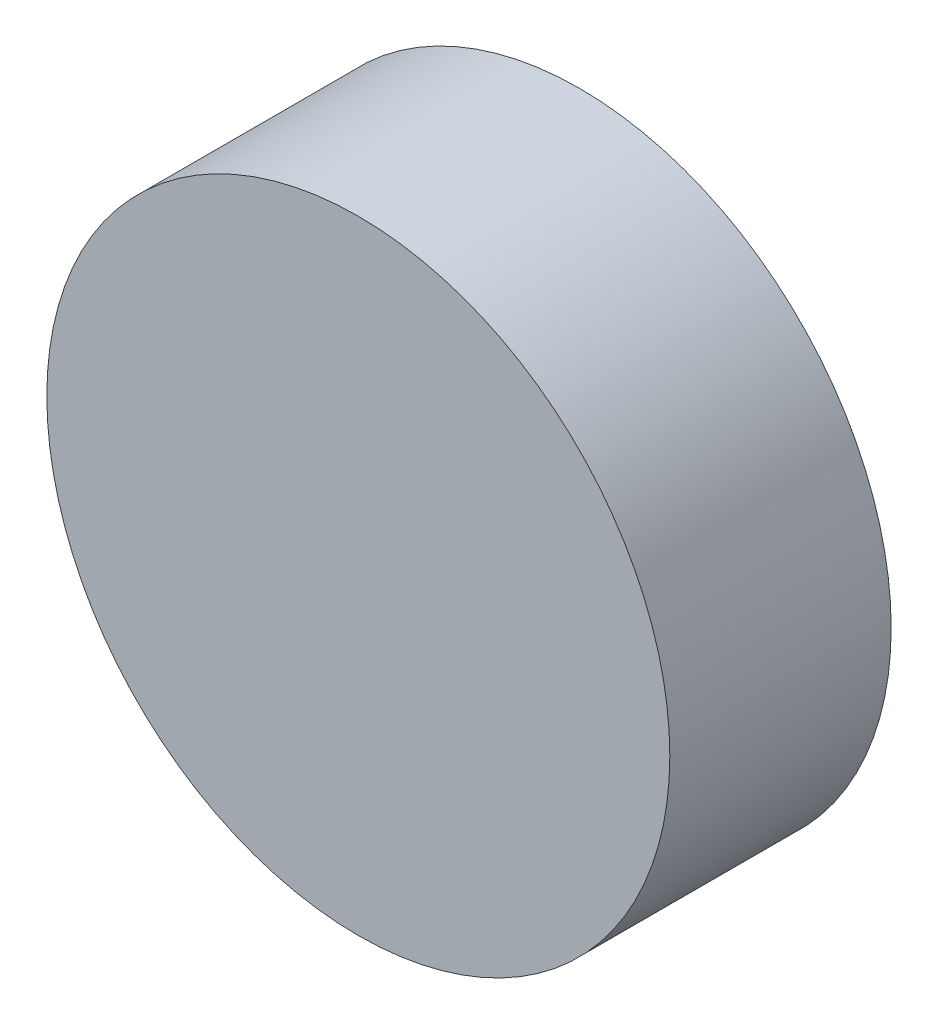
ISO-10303-21;
HEADER;
FILE_DESCRIPTION(('STEP AP214'),'2;1');
FILE_NAME('part.step','',(''),(''),'','','');
FILE_SCHEMA(('AUTOMOTIVE_DESIGN { 1 0 10303 214 1 1 1 1 }'));
ENDSEC;
DATA;
#1=APPLICATION_CONTEXT('core data for automotive mechanical design processes');
#2=APPLICATION_PROTOCOL_DEFINITION('international standard','automotive_design',2000,#1);
#3=PRODUCT_CONTEXT('',#1,'mechanical');
#4=PRODUCT('Part','Part','',(#3));
#5=PRODUCT_RELATED_PRODUCT_CATEGORY('part','',(#4));
#6=PRODUCT_DEFINITION_FORMATION('','',#4);
#7=PRODUCT_DEFINITION_CONTEXT('part definition',#1,'design');
#8=PRODUCT_DEFINITION('design','',#6,#7);
#9=PRODUCT_DEFINITION_SHAPE('','',#8);
#10=(LENGTH_UNIT() NAMED_UNIT(*) SI_UNIT(.MILLI.,.METRE.));
#11=(NAMED_UNIT(*) PLANE_ANGLE_UNIT() SI_UNIT($,.RADIAN.));
#12=(NAMED_UNIT(*) SI_UNIT($,.STERADIAN.) SOLID_ANGLE_UNIT());
#13=UNCERTAINTY_MEASURE_WITH_UNIT(LENGTH_MEASURE(1.E-05),#10,'distance_accuracy_value','');
#14=(GEOMETRIC_REPRESENTATION_CONTEXT(3) GLOBAL_UNCERTAINTY_ASSIGNED_CONTEXT((#13)) GLOBAL_UNIT_ASSIGNED_CONTEXT((#10,
#11,#12)) REPRESENTATION_CONTEXT('',''));
#15=CARTESIAN_POINT('',(0.,0.,0.));
#16=DIRECTION('',(0.,0.,1.));
#17=DIRECTION('',(1.,0.,0.));
#18=AXIS2_PLACEMENT_3D('',#15,#16,#17);
#19=CARTESIAN_POINT('',(0.,0.,50.8));
#20=DIRECTION('',(0.,0.,-1.));
#21=DIRECTION('',(-1.,0.,0.));
#22=AXIS2_PLACEMENT_3D('',#19,#20,#21);
#23=CYLINDRICAL_SURFACE('',#22,71.4883);
#24=CARTESIAN_POINT('',(0.,0.,50.8));
#25=DIRECTION('',(0.,0.,1.));
#26=DIRECTION('',(1.,0.,0.));
#27=AXIS2_PLACEMENT_3D('',#24,#25,#26);
#28=CIRCLE('',#27,71.4883);
#29=CARTESIAN_POINT('',(71.4883,0.,50.8));
#30=VERTEX_POINT('',#29);
#31=EDGE_CURVE('E10',#30,#30,#28,.T.);
#32=ORIENTED_EDGE('',*,*,#31,.F.);
#33=EDGE_LOOP('',(#32));
#34=FACE_BOUND('',#33,.T.);
#35=CARTESIAN_POINT('',(0.,0.,0.));
#36=DIRECTION('',(0.,0.,1.));
#37=DIRECTION('',(1.,0.,0.));
#38=AXIS2_PLACEMENT_3D('',#35,#36,#37);
#39=CIRCLE('',#38,71.4883);
#40=CARTESIAN_POINT('',(71.4883,0.,0.));
#41=VERTEX_POINT('',#40);
#42=EDGE_CURVE('E40',#41,#41,#39,.T.);
#43=ORIENTED_EDGE('',*,*,#42,.T.);
#44=EDGE_LOOP('',(#43));
#45=FACE_BOUND('',#44,.T.);
#46=ADVANCED_FACE('F37',(#34,#45),#23,.T.);
#47=CARTESIAN_POINT('',(0.,0.,50.8));
#48=DIRECTION('',(0.,0.,1.));
#49=DIRECTION('',(1.,0.,0.));
#50=AXIS2_PLACEMENT_3D('',#47,#48,#49);
#51=PLANE('',#50);
#52=ORIENTED_EDGE('',*,*,#31,.T.);
#53=EDGE_LOOP('',(#52));
#54=FACE_BOUND('',#53,.T.);
#55=ADVANCED_FACE('F54',(#54),#51,.T.);
#56=CARTESIAN_POINT('',(0.,0.,0.));
#57=DIRECTION('',(0.,0.,1.));
#58=DIRECTION('',(1.,0.,0.));
#59=AXIS2_PLACEMENT_3D('',#56,#57,#58);
#60=PLANE('',#59);
#61=ORIENTED_EDGE('',*,*,#42,.F.);
#62=EDGE_LOOP('',(#61));
#63=FACE_BOUND('',#62,.T.);
#64=ADVANCED_FACE('F52',(#63),#60,.F.);
#65=CLOSED_SHELL('',(#46,#55,#64));
#66=MANIFOLD_SOLID_BREP('B2',#65);
#67=ADVANCED_BREP_SHAPE_REPRESENTATION('',(#18,#66),#14);
#68=SHAPE_DEFINITION_REPRESENTATION(#9,#67);
ENDSEC;
END-ISO-10303-21;
